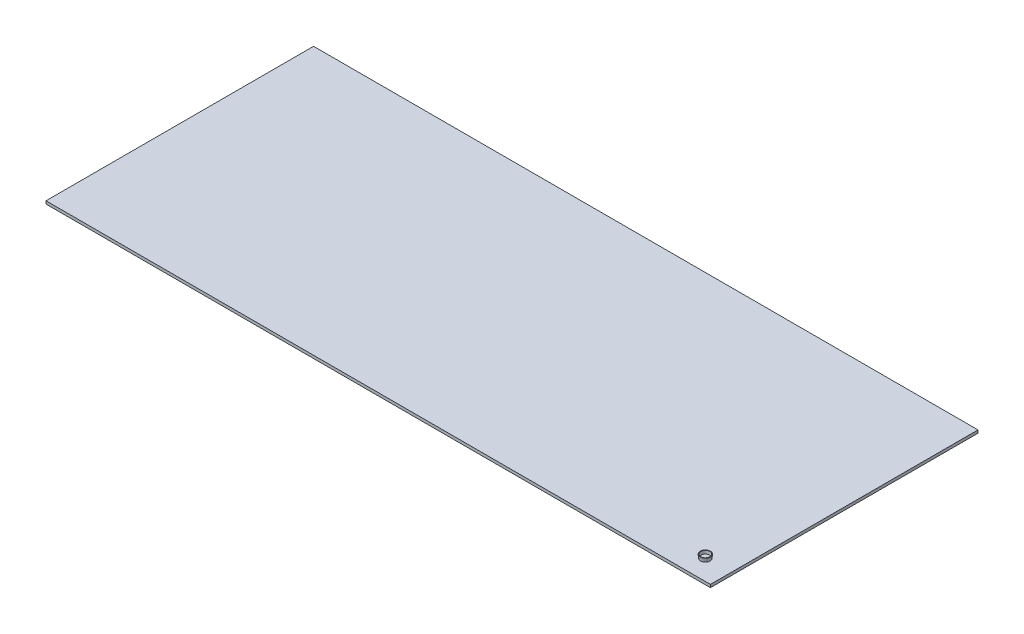
ISO-10303-21;
HEADER;
FILE_DESCRIPTION(('STEP AP214'),'2;1');
FILE_NAME('part.step','',(''),(''),'','','');
FILE_SCHEMA(('AUTOMOTIVE_DESIGN { 1 0 10303 214 1 1 1 1 }'));
ENDSEC;
DATA;
#1=APPLICATION_CONTEXT('core data for automotive mechanical design processes');
#2=APPLICATION_PROTOCOL_DEFINITION('international standard','automotive_design',2000,#1);
#3=PRODUCT_CONTEXT('',#1,'mechanical');
#4=PRODUCT('Part','Part','',(#3));
#5=PRODUCT_RELATED_PRODUCT_CATEGORY('part','',(#4));
#6=PRODUCT_DEFINITION_FORMATION('','',#4);
#7=PRODUCT_DEFINITION_CONTEXT('part definition',#1,'design');
#8=PRODUCT_DEFINITION('design','',#6,#7);
#9=PRODUCT_DEFINITION_SHAPE('','',#8);
#10=(LENGTH_UNIT() NAMED_UNIT(*) SI_UNIT(.MILLI.,.METRE.));
#11=(NAMED_UNIT(*) PLANE_ANGLE_UNIT() SI_UNIT($,.RADIAN.));
#12=(NAMED_UNIT(*) SI_UNIT($,.STERADIAN.) SOLID_ANGLE_UNIT());
#13=UNCERTAINTY_MEASURE_WITH_UNIT(LENGTH_MEASURE(1.E-05),#10,'distance_accuracy_value','');
#14=(GEOMETRIC_REPRESENTATION_CONTEXT(3) GLOBAL_UNCERTAINTY_ASSIGNED_CONTEXT((#13)) GLOBAL_UNIT_ASSIGNED_CONTEXT((#10,
#11,#12)) REPRESENTATION_CONTEXT('',''));
#15=CARTESIAN_POINT('',(0.,0.,0.));
#16=DIRECTION('',(0.,0.,1.));
#17=DIRECTION('',(1.,0.,0.));
#18=AXIS2_PLACEMENT_3D('',#15,#16,#17);
#19=CARTESIAN_POINT('',(127.99991,0.600000000000003,78.0035422510954));
#20=DIRECTION('',(0.,1.,0.));
#21=DIRECTION('',(0.,0.,1.));
#22=AXIS2_PLACEMENT_3D('',#19,#20,#21);
#23=CONICAL_SURFACE('',#22,2.,0.0872664625997181);
#24=CARTESIAN_POINT('',(127.99991,2.1,78.0035422510954));
#25=DIRECTION('',(0.,-1.,0.));
#26=DIRECTION('',(0.,0.,-1.));
#27=AXIS2_PLACEMENT_3D('',#24,#25,#26);
#28=CIRCLE('',#27,2.13123299528889);
#29=CARTESIAN_POINT('',(127.99991,2.1,75.8723092558065));
#30=VERTEX_POINT('',#29);
#31=EDGE_CURVE('E64',#30,#30,#28,.T.);
#32=ORIENTED_EDGE('',*,*,#31,.T.);
#33=EDGE_LOOP('',(#32));
#34=FACE_BOUND('',#33,.T.);
#35=CARTESIAN_POINT('',(127.99991,0.600000000000003,78.0035422510954));
#36=DIRECTION('',(0.,-1.,0.));
#37=DIRECTION('',(0.,0.,-1.));
#38=AXIS2_PLACEMENT_3D('',#35,#36,#37);
#39=CIRCLE('',#38,2.);
#40=CARTESIAN_POINT('',(127.99991,0.600000000000003,76.0035422510954));
#41=VERTEX_POINT('',#40);
#42=EDGE_CURVE('E11',#41,#41,#39,.T.);
#43=ORIENTED_EDGE('',*,*,#42,.F.);
#44=EDGE_LOOP('',(#43));
#45=FACE_BOUND('',#44,.T.);
#46=ADVANCED_FACE('F49',(#34,#45),#23,.T.);
#47=CARTESIAN_POINT('',(125.868677004711,2.1,78.0035422510954));
#48=DIRECTION('',(0.,1.,0.));
#49=DIRECTION('',(0.,0.,1.));
#50=AXIS2_PLACEMENT_3D('',#47,#48,#49);
#51=PLANE('',#50);
#52=CARTESIAN_POINT('',(127.99991,2.1,78.0035422510954));
#53=DIRECTION('',(0.,-1.,0.));
#54=DIRECTION('',(0.,0.,-1.));
#55=AXIS2_PLACEMENT_3D('',#52,#53,#54);
#56=CIRCLE('',#55,1.88123299528889);
#57=CARTESIAN_POINT('',(127.99991,2.1,76.1223092558065));
#58=VERTEX_POINT('',#57);
#59=EDGE_CURVE('E60',#58,#58,#56,.T.);
#60=ORIENTED_EDGE('',*,*,#59,.T.);
#61=EDGE_LOOP('',(#60));
#62=FACE_BOUND('',#61,.T.);
#63=ORIENTED_EDGE('',*,*,#31,.F.);
#64=EDGE_LOOP('',(#63));
#65=FACE_BOUND('',#64,.T.);
#66=ADVANCED_FACE('F72',(#62,#65),#51,.T.);
#67=CARTESIAN_POINT('',(127.99991,2.1,78.0035422510954));
#68=DIRECTION('',(0.,1.,0.));
#69=DIRECTION('',(0.,0.,1.));
#70=AXIS2_PLACEMENT_3D('',#67,#68,#69);
#71=CONICAL_SURFACE('',#70,1.88123299528889,0.0872664625997182);
#72=CARTESIAN_POINT('',(127.99991,0.850000000000004,78.0035422510954));
#73=DIRECTION('',(0.,-1.,0.));
#74=DIRECTION('',(0.,0.,-1.));
#75=AXIS2_PLACEMENT_3D('',#72,#73,#74);
#76=CIRCLE('',#75,1.77187216588148);
#77=CARTESIAN_POINT('',(127.99991,0.850000000000004,76.2316700852139));
#78=VERTEX_POINT('',#77);
#79=EDGE_CURVE('E56',#78,#78,#76,.T.);
#80=ORIENTED_EDGE('',*,*,#79,.T.);
#81=EDGE_LOOP('',(#80));
#82=FACE_BOUND('',#81,.T.);
#83=ORIENTED_EDGE('',*,*,#59,.F.);
#84=EDGE_LOOP('',(#83));
#85=FACE_BOUND('',#84,.T.);
#86=ADVANCED_FACE('F74',(#82,#85),#71,.F.);
#87=CARTESIAN_POINT('',(126.228037834119,0.850000000000003,78.0035422510954));
#88=DIRECTION('',(0.,1.,0.));
#89=DIRECTION('',(0.,0.,1.));
#90=AXIS2_PLACEMENT_3D('',#87,#88,#89);
#91=PLANE('',#90);
#92=ORIENTED_EDGE('',*,*,#79,.F.);
#93=EDGE_LOOP('',(#92));
#94=FACE_BOUND('',#93,.T.);
#95=ADVANCED_FACE('F81',(#94),#91,.T.);
#96=CARTESIAN_POINT('',(129.99991,0.6,78.0035422510954));
#97=DIRECTION('',(0.,-1.,0.));
#98=DIRECTION('',(0.,0.,-1.));
#99=AXIS2_PLACEMENT_3D('',#96,#97,#98);
#100=PLANE('',#99);
#101=ORIENTED_EDGE('',*,*,#42,.T.);
#102=EDGE_LOOP('',(#101));
#103=FACE_BOUND('',#102,.T.);
#104=ADVANCED_FACE('F51',(#103),#100,.T.);
#105=CLOSED_SHELL('',(#46,#66,#86,#95,#104));
#106=MANIFOLD_SOLID_BREP('B2',#105);
#107=CARTESIAN_POINT('',(138.49991,0.6,86.3785422510954));
#108=DIRECTION('',(0.,0.,-1.));
#109=DIRECTION('',(-1.,0.,0.));
#110=AXIS2_PLACEMENT_3D('',#107,#108,#109);
#111=PLANE('',#110);
#112=DIRECTION('',(1.,0.,0.));
#113=VECTOR('',#112,1.);
#114=CARTESIAN_POINT('',(138.49991,-0.6,86.3785422510954));
#115=LINE('',#114,#113);
#116=CARTESIAN_POINT('',(-138.499910259713,-0.6,86.3785422510954));
#117=VERTEX_POINT('',#116);
#118=CARTESIAN_POINT('',(138.49991,-0.6,86.3785422510954));
#119=VERTEX_POINT('',#118);
#120=EDGE_CURVE('E167',#117,#119,#115,.T.);
#121=ORIENTED_EDGE('',*,*,#120,.T.);
#122=DIRECTION('',(0.,-1.,0.));
#123=VECTOR('',#122,1.);
#124=CARTESIAN_POINT('',(138.49991,0.6,86.3785422510954));
#125=LINE('',#124,#123);
#126=CARTESIAN_POINT('',(138.49991,0.6,86.3785422510954));
#127=VERTEX_POINT('',#126);
#128=EDGE_CURVE('E193',#127,#119,#125,.T.);
#129=ORIENTED_EDGE('',*,*,#128,.F.);
#130=DIRECTION('',(1.,0.,0.));
#131=VECTOR('',#130,1.);
#132=CARTESIAN_POINT('',(138.49991,0.6,86.3785422510954));
#133=LINE('',#132,#131);
#134=CARTESIAN_POINT('',(-138.499910259713,0.6,86.3785422510954));
#135=VERTEX_POINT('',#134);
#136=EDGE_CURVE('E144',#135,#127,#133,.T.);
#137=ORIENTED_EDGE('',*,*,#136,.F.);
#138=DIRECTION('',(0.,-1.,0.));
#139=VECTOR('',#138,1.);
#140=CARTESIAN_POINT('',(-138.499910259713,0.6,86.3785422510954));
#141=LINE('',#140,#139);
#142=EDGE_CURVE('E188',#135,#117,#141,.T.);
#143=ORIENTED_EDGE('',*,*,#142,.T.);
#144=EDGE_LOOP('',(#121,#129,#137,#143));
#145=FACE_BOUND('',#144,.T.);
#146=ADVANCED_FACE('F125',(#145),#111,.F.);
#147=CARTESIAN_POINT('',(-138.499910259713,0.6,86.3785422510954));
#148=DIRECTION('',(1.,0.,0.));
#149=DIRECTION('',(0.,0.,-1.));
#150=AXIS2_PLACEMENT_3D('',#147,#148,#149);
#151=PLANE('',#150);
#152=DIRECTION('',(0.,0.,1.));
#153=VECTOR('',#152,1.);
#154=CARTESIAN_POINT('',(-138.499910259713,-0.6,86.3785422510954));
#155=LINE('',#154,#153);
#156=CARTESIAN_POINT('',(-138.499910259713,-0.6,-25.1766374891907));
#157=VERTEX_POINT('',#156);
#158=EDGE_CURVE('E161',#157,#117,#155,.T.);
#159=ORIENTED_EDGE('',*,*,#158,.T.);
#160=ORIENTED_EDGE('',*,*,#142,.F.);
#161=DIRECTION('',(0.,0.,1.));
#162=VECTOR('',#161,1.);
#163=CARTESIAN_POINT('',(-138.499910259713,0.6,86.3785422510954));
#164=LINE('',#163,#162);
#165=CARTESIAN_POINT('',(-138.499910259713,0.6,-25.1766374891907));
#166=VERTEX_POINT('',#165);
#167=EDGE_CURVE('E178',#166,#135,#164,.T.);
#168=ORIENTED_EDGE('',*,*,#167,.F.);
#169=DIRECTION('',(0.,-1.,0.));
#170=VECTOR('',#169,1.);
#171=CARTESIAN_POINT('',(-138.499910259713,0.6,-25.1766374891907));
#172=LINE('',#171,#170);
#173=EDGE_CURVE('E184',#166,#157,#172,.T.);
#174=ORIENTED_EDGE('',*,*,#173,.T.);
#175=EDGE_LOOP('',(#159,#160,#168,#174));
#176=FACE_BOUND('',#175,.T.);
#177=ADVANCED_FACE('F189',(#176),#151,.F.);
#178=CARTESIAN_POINT('',(138.49991,0.6,-25.1766374891907));
#179=DIRECTION('',(0.,0.,1.));
#180=DIRECTION('',(1.,0.,0.));
#181=AXIS2_PLACEMENT_3D('',#178,#179,#180);
#182=PLANE('',#181);
#183=DIRECTION('',(-1.,0.,0.));
#184=VECTOR('',#183,1.);
#185=CARTESIAN_POINT('',(138.49991,-0.6,-25.1766374891907));
#186=LINE('',#185,#184);
#187=CARTESIAN_POINT('',(138.49991,-0.6,-25.1766374891907));
#188=VERTEX_POINT('',#187);
#189=EDGE_CURVE('E186',#188,#157,#186,.T.);
#190=ORIENTED_EDGE('',*,*,#189,.T.);
#191=ORIENTED_EDGE('',*,*,#173,.F.);
#192=DIRECTION('',(-1.,0.,0.));
#193=VECTOR('',#192,1.);
#194=CARTESIAN_POINT('',(138.49991,0.6,-25.1766374891907));
#195=LINE('',#194,#193);
#196=CARTESIAN_POINT('',(138.49991,0.6,-25.1766374891907));
#197=VERTEX_POINT('',#196);
#198=EDGE_CURVE('E175',#197,#166,#195,.T.);
#199=ORIENTED_EDGE('',*,*,#198,.F.);
#200=DIRECTION('',(0.,-1.,0.));
#201=VECTOR('',#200,1.);
#202=CARTESIAN_POINT('',(138.49991,0.6,-25.1766374891907));
#203=LINE('',#202,#201);
#204=EDGE_CURVE('E129',#197,#188,#203,.T.);
#205=ORIENTED_EDGE('',*,*,#204,.T.);
#206=EDGE_LOOP('',(#190,#191,#199,#205));
#207=FACE_BOUND('',#206,.T.);
#208=ADVANCED_FACE('F185',(#207),#182,.F.);
#209=CARTESIAN_POINT('',(0.,-0.6,0.));
#210=DIRECTION('',(0.,1.,0.));
#211=DIRECTION('',(0.,0.,1.));
#212=AXIS2_PLACEMENT_3D('',#209,#210,#211);
#213=PLANE('',#212);
#214=CARTESIAN_POINT('',(127.99991,-0.600000000000003,78.0035422510954));
#215=DIRECTION('',(0.,-1.,0.));
#216=DIRECTION('',(0.,0.,-1.));
#217=AXIS2_PLACEMENT_3D('',#214,#215,#216);
#218=CIRCLE('',#217,1.8950136037689);
#219=CARTESIAN_POINT('',(127.99991,-0.600000000000003,76.1085286473265));
#220=VERTEX_POINT('',#219);
#221=EDGE_CURVE('E201',#220,#220,#218,.T.);
#222=ORIENTED_EDGE('',*,*,#221,.F.);
#223=EDGE_LOOP('',(#222));
#224=FACE_BOUND('',#223,.T.);
#225=DIRECTION('',(0.,0.,-1.));
#226=VECTOR('',#225,1.);
#227=CARTESIAN_POINT('',(138.49991,-0.6,86.3785422510954));
#228=LINE('',#227,#226);
#229=EDGE_CURVE('E197',#119,#188,#228,.T.);
#230=ORIENTED_EDGE('',*,*,#229,.F.);
#231=ORIENTED_EDGE('',*,*,#120,.F.);
#232=ORIENTED_EDGE('',*,*,#158,.F.);
#233=ORIENTED_EDGE('',*,*,#189,.F.);
#234=EDGE_LOOP('',(#230,#231,#232,#233));
#235=FACE_BOUND('',#234,.T.);
#236=ADVANCED_FACE('F213',(#224,#235),#213,.F.);
#237=CARTESIAN_POINT('',(138.49991,0.6,86.3785422510954));
#238=DIRECTION('',(-1.,0.,0.));
#239=DIRECTION('',(0.,0.,1.));
#240=AXIS2_PLACEMENT_3D('',#237,#238,#239);
#241=PLANE('',#240);
#242=ORIENTED_EDGE('',*,*,#229,.T.);
#243=ORIENTED_EDGE('',*,*,#204,.F.);
#244=DIRECTION('',(0.,0.,-1.));
#245=VECTOR('',#244,1.);
#246=CARTESIAN_POINT('',(138.49991,0.6,86.3785422510954));
#247=LINE('',#246,#245);
#248=EDGE_CURVE('E180',#127,#197,#247,.T.);
#249=ORIENTED_EDGE('',*,*,#248,.F.);
#250=ORIENTED_EDGE('',*,*,#128,.T.);
#251=EDGE_LOOP('',(#242,#243,#249,#250));
#252=FACE_BOUND('',#251,.T.);
#253=ADVANCED_FACE('F127',(#252),#241,.F.);
#254=CARTESIAN_POINT('',(0.,0.6,0.));
#255=DIRECTION('',(0.,1.,0.));
#256=DIRECTION('',(0.,0.,1.));
#257=AXIS2_PLACEMENT_3D('',#254,#255,#256);
#258=PLANE('',#257);
#259=CARTESIAN_POINT('',(127.99991,0.600000000000003,78.0035422510954));
#260=DIRECTION('',(0.,-1.,0.));
#261=DIRECTION('',(0.,0.,-1.));
#262=AXIS2_PLACEMENT_3D('',#259,#260,#261);
#263=CIRCLE('',#262,2.);
#264=CARTESIAN_POINT('',(127.99991,0.600000000000003,76.0035422510954));
#265=VERTEX_POINT('',#264);
#266=EDGE_CURVE('E47',#265,#265,#263,.T.);
#267=ORIENTED_EDGE('',*,*,#266,.T.);
#268=EDGE_LOOP('',(#267));
#269=FACE_BOUND('',#268,.T.);
#270=ORIENTED_EDGE('',*,*,#248,.T.);
#271=ORIENTED_EDGE('',*,*,#198,.T.);
#272=ORIENTED_EDGE('',*,*,#167,.T.);
#273=ORIENTED_EDGE('',*,*,#136,.T.);
#274=EDGE_LOOP('',(#270,#271,#272,#273));
#275=FACE_BOUND('',#274,.T.);
#276=ADVANCED_FACE('F176',(#269,#275),#258,.T.);
#277=CARTESIAN_POINT('',(127.99991,0.600000000000003,78.0035422510954));
#278=DIRECTION('',(0.,1.,0.));
#279=DIRECTION('',(0.,0.,1.));
#280=AXIS2_PLACEMENT_3D('',#277,#278,#279);
#281=CONICAL_SURFACE('',#280,2.,0.0872664625997127);
#282=ORIENTED_EDGE('',*,*,#221,.T.);
#283=EDGE_LOOP('',(#282));
#284=FACE_BOUND('',#283,.T.);
#285=ORIENTED_EDGE('',*,*,#266,.F.);
#286=EDGE_LOOP('',(#285));
#287=FACE_BOUND('',#286,.T.);
#288=ADVANCED_FACE('F221',(#284,#287),#281,.F.);
#289=CLOSED_SHELL('',(#146,#177,#208,#236,#253,#276,#288));
#290=MANIFOLD_SOLID_BREP('B6',#289);
#291=ADVANCED_BREP_SHAPE_REPRESENTATION('',(#18,#106,#290),#14);
#292=SHAPE_DEFINITION_REPRESENTATION(#9,#291);
ENDSEC;
END-ISO-10303-21;
